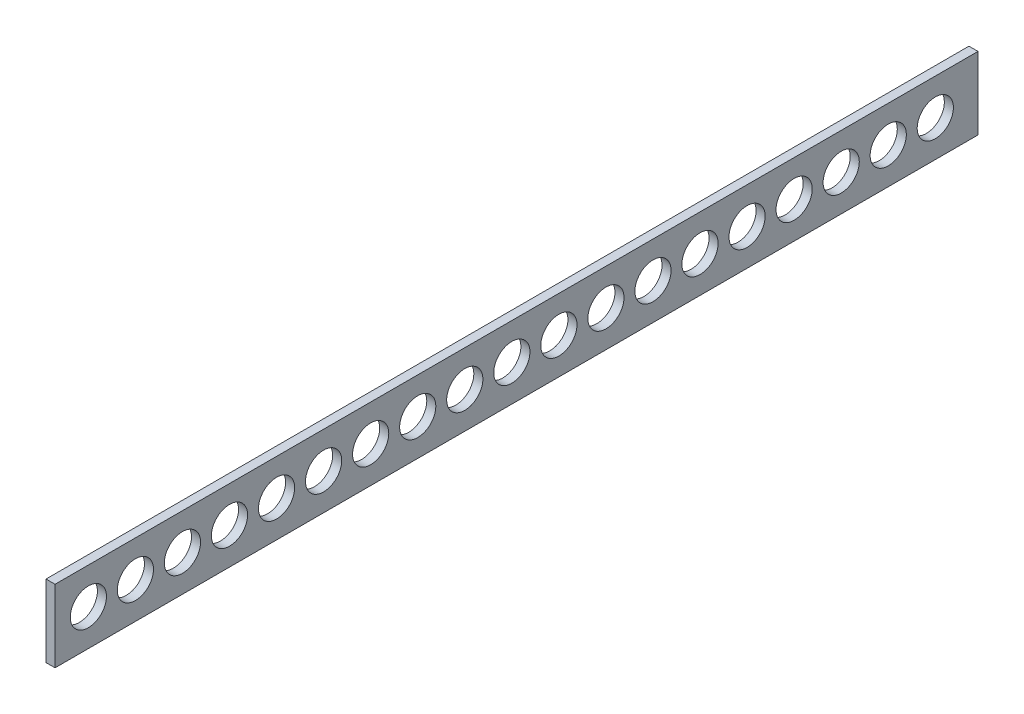
ISO-10303-21;
HEADER;
FILE_DESCRIPTION(('STEP AP214'),'2;1');
FILE_NAME('part.step','',(''),(''),'','','');
FILE_SCHEMA(('AUTOMOTIVE_DESIGN { 1 0 10303 214 1 1 1 1 }'));
ENDSEC;
DATA;
#1=APPLICATION_CONTEXT('core data for automotive mechanical design processes');
#2=APPLICATION_PROTOCOL_DEFINITION('international standard','automotive_design',2000,#1);
#3=PRODUCT_CONTEXT('',#1,'mechanical');
#4=PRODUCT('Part','Part','',(#3));
#5=PRODUCT_RELATED_PRODUCT_CATEGORY('part','',(#4));
#6=PRODUCT_DEFINITION_FORMATION('','',#4);
#7=PRODUCT_DEFINITION_CONTEXT('part definition',#1,'design');
#8=PRODUCT_DEFINITION('design','',#6,#7);
#9=PRODUCT_DEFINITION_SHAPE('','',#8);
#10=(LENGTH_UNIT() NAMED_UNIT(*) SI_UNIT(.MILLI.,.METRE.));
#11=(NAMED_UNIT(*) PLANE_ANGLE_UNIT() SI_UNIT($,.RADIAN.));
#12=(NAMED_UNIT(*) SI_UNIT($,.STERADIAN.) SOLID_ANGLE_UNIT());
#13=UNCERTAINTY_MEASURE_WITH_UNIT(LENGTH_MEASURE(1.E-05),#10,'distance_accuracy_value','');
#14=(GEOMETRIC_REPRESENTATION_CONTEXT(3) GLOBAL_UNCERTAINTY_ASSIGNED_CONTEXT((#13)) GLOBAL_UNIT_ASSIGNED_CONTEXT((#10,
#11,#12)) REPRESENTATION_CONTEXT('',''));
#15=CARTESIAN_POINT('',(0.,0.,0.));
#16=DIRECTION('',(0.,0.,1.));
#17=DIRECTION('',(1.,0.,0.));
#18=AXIS2_PLACEMENT_3D('',#15,#16,#17);
#19=CARTESIAN_POINT('',(6.35,0.,0.));
#20=DIRECTION('',(-1.,0.,0.));
#21=DIRECTION('',(0.,0.,1.));
#22=AXIS2_PLACEMENT_3D('',#19,#20,#21);
#23=PLANE('',#22);
#24=DIRECTION('',(0.,-1.,0.));
#25=VECTOR('',#24,1.);
#26=CARTESIAN_POINT('',(6.35,0.,0.));
#27=LINE('',#26,#25);
#28=CARTESIAN_POINT('',(6.35,50.8,0.));
#29=VERTEX_POINT('',#28);
#30=CARTESIAN_POINT('',(6.35,0.,0.));
#31=VERTEX_POINT('',#30);
#32=EDGE_CURVE('E92',#29,#31,#27,.T.);
#33=ORIENTED_EDGE('',*,*,#32,.T.);
#34=DIRECTION('',(0.,0.,-1.));
#35=VECTOR('',#34,1.);
#36=CARTESIAN_POINT('',(6.35,0.,0.));
#37=LINE('',#36,#35);
#38=CARTESIAN_POINT('',(6.35,0.,-647.7));
#39=VERTEX_POINT('',#38);
#40=EDGE_CURVE('E87',#31,#39,#37,.T.);
#41=ORIENTED_EDGE('',*,*,#40,.T.);
#42=DIRECTION('',(0.,1.,0.));
#43=VECTOR('',#42,1.);
#44=CARTESIAN_POINT('',(6.35,0.,-647.7));
#45=LINE('',#44,#43);
#46=CARTESIAN_POINT('',(6.35,50.8,-647.7));
#47=VERTEX_POINT('',#46);
#48=EDGE_CURVE('E90',#39,#47,#45,.T.);
#49=ORIENTED_EDGE('',*,*,#48,.T.);
#50=DIRECTION('',(0.,0.,1.));
#51=VECTOR('',#50,1.);
#52=CARTESIAN_POINT('',(6.35,50.8,0.));
#53=LINE('',#52,#51);
#54=EDGE_CURVE('E57',#47,#29,#53,.T.);
#55=ORIENTED_EDGE('',*,*,#54,.T.);
#56=EDGE_LOOP('',(#33,#41,#49,#55));
#57=FACE_BOUND('',#56,.T.);
#58=CARTESIAN_POINT('',(6.35,25.4,-23.3708321513043));
#59=DIRECTION('',(1.,0.,0.));
#60=DIRECTION('',(0.,0.,-1.));
#61=AXIS2_PLACEMENT_3D('',#58,#59,#60);
#62=CIRCLE('',#61,12.7);
#63=CARTESIAN_POINT('',(6.35,25.4,-36.0708321513043));
#64=VERTEX_POINT('',#63);
#65=EDGE_CURVE('E112',#64,#64,#62,.T.);
#66=ORIENTED_EDGE('',*,*,#65,.F.);
#67=EDGE_LOOP('',(#66));
#68=FACE_BOUND('',#67,.T.);
#69=CARTESIAN_POINT('',(6.35,25.4,-56.3908321513043));
#70=DIRECTION('',(1.,0.,0.));
#71=DIRECTION('',(0.,0.,-1.));
#72=AXIS2_PLACEMENT_3D('',#69,#70,#71);
#73=CIRCLE('',#72,12.7);
#74=CARTESIAN_POINT('',(6.35,25.4,-69.0908321513043));
#75=VERTEX_POINT('',#74);
#76=EDGE_CURVE('E134',#75,#75,#73,.T.);
#77=ORIENTED_EDGE('',*,*,#76,.F.);
#78=EDGE_LOOP('',(#77));
#79=FACE_BOUND('',#78,.T.);
#80=CARTESIAN_POINT('',(6.35,25.4,-89.4108321513043));
#81=DIRECTION('',(1.,0.,0.));
#82=DIRECTION('',(0.,0.,-1.));
#83=AXIS2_PLACEMENT_3D('',#80,#81,#82);
#84=CIRCLE('',#83,12.7);
#85=CARTESIAN_POINT('',(6.35,25.4,-102.110832151304));
#86=VERTEX_POINT('',#85);
#87=EDGE_CURVE('E142',#86,#86,#84,.T.);
#88=ORIENTED_EDGE('',*,*,#87,.F.);
#89=EDGE_LOOP('',(#88));
#90=FACE_BOUND('',#89,.T.);
#91=CARTESIAN_POINT('',(6.35,25.4,-122.430832151304));
#92=DIRECTION('',(1.,0.,0.));
#93=DIRECTION('',(0.,0.,-1.));
#94=AXIS2_PLACEMENT_3D('',#91,#92,#93);
#95=CIRCLE('',#94,12.7);
#96=CARTESIAN_POINT('',(6.35,25.4,-135.130832151304));
#97=VERTEX_POINT('',#96);
#98=EDGE_CURVE('E150',#97,#97,#95,.T.);
#99=ORIENTED_EDGE('',*,*,#98,.F.);
#100=EDGE_LOOP('',(#99));
#101=FACE_BOUND('',#100,.T.);
#102=CARTESIAN_POINT('',(6.35,25.4,-155.450832151304));
#103=DIRECTION('',(1.,0.,0.));
#104=DIRECTION('',(0.,0.,-1.));
#105=AXIS2_PLACEMENT_3D('',#102,#103,#104);
#106=CIRCLE('',#105,12.7);
#107=CARTESIAN_POINT('',(6.35,25.4,-168.150832151304));
#108=VERTEX_POINT('',#107);
#109=EDGE_CURVE('E158',#108,#108,#106,.T.);
#110=ORIENTED_EDGE('',*,*,#109,.F.);
#111=EDGE_LOOP('',(#110));
#112=FACE_BOUND('',#111,.T.);
#113=CARTESIAN_POINT('',(6.35,25.4,-188.470832151304));
#114=DIRECTION('',(1.,0.,0.));
#115=DIRECTION('',(0.,0.,-1.));
#116=AXIS2_PLACEMENT_3D('',#113,#114,#115);
#117=CIRCLE('',#116,12.7);
#118=CARTESIAN_POINT('',(6.35,25.4,-201.170832151304));
#119=VERTEX_POINT('',#118);
#120=EDGE_CURVE('E166',#119,#119,#117,.T.);
#121=ORIENTED_EDGE('',*,*,#120,.F.);
#122=EDGE_LOOP('',(#121));
#123=FACE_BOUND('',#122,.T.);
#124=CARTESIAN_POINT('',(6.35,25.4,-221.490832151304));
#125=DIRECTION('',(1.,0.,0.));
#126=DIRECTION('',(0.,0.,-1.));
#127=AXIS2_PLACEMENT_3D('',#124,#125,#126);
#128=CIRCLE('',#127,12.7);
#129=CARTESIAN_POINT('',(6.35,25.4,-234.190832151304));
#130=VERTEX_POINT('',#129);
#131=EDGE_CURVE('E174',#130,#130,#128,.T.);
#132=ORIENTED_EDGE('',*,*,#131,.F.);
#133=EDGE_LOOP('',(#132));
#134=FACE_BOUND('',#133,.T.);
#135=CARTESIAN_POINT('',(6.35,25.4,-254.510832151304));
#136=DIRECTION('',(1.,0.,0.));
#137=DIRECTION('',(0.,0.,-1.));
#138=AXIS2_PLACEMENT_3D('',#135,#136,#137);
#139=CIRCLE('',#138,12.7);
#140=CARTESIAN_POINT('',(6.35,25.4,-267.210832151304));
#141=VERTEX_POINT('',#140);
#142=EDGE_CURVE('E182',#141,#141,#139,.T.);
#143=ORIENTED_EDGE('',*,*,#142,.F.);
#144=EDGE_LOOP('',(#143));
#145=FACE_BOUND('',#144,.T.);
#146=CARTESIAN_POINT('',(6.35,25.4,-287.530832151304));
#147=DIRECTION('',(1.,0.,0.));
#148=DIRECTION('',(0.,0.,-1.));
#149=AXIS2_PLACEMENT_3D('',#146,#147,#148);
#150=CIRCLE('',#149,12.7);
#151=CARTESIAN_POINT('',(6.35,25.4,-300.230832151304));
#152=VERTEX_POINT('',#151);
#153=EDGE_CURVE('E190',#152,#152,#150,.T.);
#154=ORIENTED_EDGE('',*,*,#153,.F.);
#155=EDGE_LOOP('',(#154));
#156=FACE_BOUND('',#155,.T.);
#157=CARTESIAN_POINT('',(6.35,25.4,-320.550832151304));
#158=DIRECTION('',(1.,0.,0.));
#159=DIRECTION('',(0.,0.,-1.));
#160=AXIS2_PLACEMENT_3D('',#157,#158,#159);
#161=CIRCLE('',#160,12.7);
#162=CARTESIAN_POINT('',(6.35,25.4,-333.250832151304));
#163=VERTEX_POINT('',#162);
#164=EDGE_CURVE('E198',#163,#163,#161,.T.);
#165=ORIENTED_EDGE('',*,*,#164,.F.);
#166=EDGE_LOOP('',(#165));
#167=FACE_BOUND('',#166,.T.);
#168=CARTESIAN_POINT('',(6.35,25.4,-353.570832151304));
#169=DIRECTION('',(1.,0.,0.));
#170=DIRECTION('',(0.,0.,-1.));
#171=AXIS2_PLACEMENT_3D('',#168,#169,#170);
#172=CIRCLE('',#171,12.7);
#173=CARTESIAN_POINT('',(6.35,25.4,-366.270832151304));
#174=VERTEX_POINT('',#173);
#175=EDGE_CURVE('E206',#174,#174,#172,.T.);
#176=ORIENTED_EDGE('',*,*,#175,.F.);
#177=EDGE_LOOP('',(#176));
#178=FACE_BOUND('',#177,.T.);
#179=CARTESIAN_POINT('',(6.35,25.4,-386.590832151304));
#180=DIRECTION('',(1.,0.,0.));
#181=DIRECTION('',(0.,0.,-1.));
#182=AXIS2_PLACEMENT_3D('',#179,#180,#181);
#183=CIRCLE('',#182,12.7);
#184=CARTESIAN_POINT('',(6.35,25.4,-399.290832151304));
#185=VERTEX_POINT('',#184);
#186=EDGE_CURVE('E214',#185,#185,#183,.T.);
#187=ORIENTED_EDGE('',*,*,#186,.F.);
#188=EDGE_LOOP('',(#187));
#189=FACE_BOUND('',#188,.T.);
#190=CARTESIAN_POINT('',(6.35,25.4,-419.610832151304));
#191=DIRECTION('',(1.,0.,0.));
#192=DIRECTION('',(0.,0.,-1.));
#193=AXIS2_PLACEMENT_3D('',#190,#191,#192);
#194=CIRCLE('',#193,12.7);
#195=CARTESIAN_POINT('',(6.35,25.4,-432.310832151304));
#196=VERTEX_POINT('',#195);
#197=EDGE_CURVE('E222',#196,#196,#194,.T.);
#198=ORIENTED_EDGE('',*,*,#197,.F.);
#199=EDGE_LOOP('',(#198));
#200=FACE_BOUND('',#199,.T.);
#201=CARTESIAN_POINT('',(6.35,25.4,-452.630832151304));
#202=DIRECTION('',(1.,0.,0.));
#203=DIRECTION('',(0.,0.,-1.));
#204=AXIS2_PLACEMENT_3D('',#201,#202,#203);
#205=CIRCLE('',#204,12.7);
#206=CARTESIAN_POINT('',(6.35,25.4,-465.330832151304));
#207=VERTEX_POINT('',#206);
#208=EDGE_CURVE('E230',#207,#207,#205,.T.);
#209=ORIENTED_EDGE('',*,*,#208,.F.);
#210=EDGE_LOOP('',(#209));
#211=FACE_BOUND('',#210,.T.);
#212=CARTESIAN_POINT('',(6.35,25.4,-485.650832151304));
#213=DIRECTION('',(1.,0.,0.));
#214=DIRECTION('',(0.,0.,-1.));
#215=AXIS2_PLACEMENT_3D('',#212,#213,#214);
#216=CIRCLE('',#215,12.7);
#217=CARTESIAN_POINT('',(6.35,25.4,-498.350832151304));
#218=VERTEX_POINT('',#217);
#219=EDGE_CURVE('E238',#218,#218,#216,.T.);
#220=ORIENTED_EDGE('',*,*,#219,.F.);
#221=EDGE_LOOP('',(#220));
#222=FACE_BOUND('',#221,.T.);
#223=CARTESIAN_POINT('',(6.35,25.4,-518.670832151304));
#224=DIRECTION('',(1.,0.,0.));
#225=DIRECTION('',(0.,0.,-1.));
#226=AXIS2_PLACEMENT_3D('',#223,#224,#225);
#227=CIRCLE('',#226,12.7000000000001);
#228=CARTESIAN_POINT('',(6.35,25.4,-531.370832151304));
#229=VERTEX_POINT('',#228);
#230=EDGE_CURVE('E246',#229,#229,#227,.T.);
#231=ORIENTED_EDGE('',*,*,#230,.F.);
#232=EDGE_LOOP('',(#231));
#233=FACE_BOUND('',#232,.T.);
#234=CARTESIAN_POINT('',(6.35,25.4,-551.690832151304));
#235=DIRECTION('',(1.,0.,0.));
#236=DIRECTION('',(0.,0.,-1.));
#237=AXIS2_PLACEMENT_3D('',#234,#235,#236);
#238=CIRCLE('',#237,12.7);
#239=CARTESIAN_POINT('',(6.35,25.4,-564.390832151304));
#240=VERTEX_POINT('',#239);
#241=EDGE_CURVE('E254',#240,#240,#238,.T.);
#242=ORIENTED_EDGE('',*,*,#241,.F.);
#243=EDGE_LOOP('',(#242));
#244=FACE_BOUND('',#243,.T.);
#245=CARTESIAN_POINT('',(6.35,25.4,-584.710832151304));
#246=DIRECTION('',(1.,0.,0.));
#247=DIRECTION('',(0.,0.,-1.));
#248=AXIS2_PLACEMENT_3D('',#245,#246,#247);
#249=CIRCLE('',#248,12.7);
#250=CARTESIAN_POINT('',(6.35,25.4,-597.410832151304));
#251=VERTEX_POINT('',#250);
#252=EDGE_CURVE('E262',#251,#251,#249,.T.);
#253=ORIENTED_EDGE('',*,*,#252,.F.);
#254=EDGE_LOOP('',(#253));
#255=FACE_BOUND('',#254,.T.);
#256=CARTESIAN_POINT('',(6.35,25.4,-617.730832151304));
#257=DIRECTION('',(1.,0.,0.));
#258=DIRECTION('',(0.,0.,-1.));
#259=AXIS2_PLACEMENT_3D('',#256,#257,#258);
#260=CIRCLE('',#259,12.7);
#261=CARTESIAN_POINT('',(6.35,25.4,-630.430832151304));
#262=VERTEX_POINT('',#261);
#263=EDGE_CURVE('E270',#262,#262,#260,.T.);
#264=ORIENTED_EDGE('',*,*,#263,.F.);
#265=EDGE_LOOP('',(#264));
#266=FACE_BOUND('',#265,.T.);
#267=ADVANCED_FACE('F39',(#57,#68,#79,#90,#101,#112,#123,#134,#145,#156,#167,#178,#189,#200,
#211,#222,#233,#244,#255,#266),#23,.F.);
#268=CARTESIAN_POINT('',(0.,0.,0.));
#269=DIRECTION('',(-1.,0.,0.));
#270=DIRECTION('',(0.,0.,1.));
#271=AXIS2_PLACEMENT_3D('',#268,#269,#270);
#272=PLANE('',#271);
#273=CARTESIAN_POINT('',(0.,25.4,-584.710832151304));
#274=DIRECTION('',(1.,0.,0.));
#275=DIRECTION('',(0.,0.,-1.));
#276=AXIS2_PLACEMENT_3D('',#273,#274,#275);
#277=CIRCLE('',#276,12.7);
#278=CARTESIAN_POINT('',(0.,25.4,-597.410832151304));
#279=VERTEX_POINT('',#278);
#280=EDGE_CURVE('E266',#279,#279,#277,.T.);
#281=ORIENTED_EDGE('',*,*,#280,.T.);
#282=EDGE_LOOP('',(#281));
#283=FACE_BOUND('',#282,.T.);
#284=CARTESIAN_POINT('',(0.,25.4,-518.670832151304));
#285=DIRECTION('',(1.,0.,0.));
#286=DIRECTION('',(0.,0.,-1.));
#287=AXIS2_PLACEMENT_3D('',#284,#285,#286);
#288=CIRCLE('',#287,12.7000000000001);
#289=CARTESIAN_POINT('',(0.,25.4,-531.370832151304));
#290=VERTEX_POINT('',#289);
#291=EDGE_CURVE('E250',#290,#290,#288,.T.);
#292=ORIENTED_EDGE('',*,*,#291,.T.);
#293=EDGE_LOOP('',(#292));
#294=FACE_BOUND('',#293,.T.);
#295=CARTESIAN_POINT('',(0.,25.4,-452.630832151304));
#296=DIRECTION('',(1.,0.,0.));
#297=DIRECTION('',(0.,0.,-1.));
#298=AXIS2_PLACEMENT_3D('',#295,#296,#297);
#299=CIRCLE('',#298,12.7);
#300=CARTESIAN_POINT('',(0.,25.4,-465.330832151304));
#301=VERTEX_POINT('',#300);
#302=EDGE_CURVE('E234',#301,#301,#299,.T.);
#303=ORIENTED_EDGE('',*,*,#302,.T.);
#304=EDGE_LOOP('',(#303));
#305=FACE_BOUND('',#304,.T.);
#306=CARTESIAN_POINT('',(0.,25.4,-386.590832151304));
#307=DIRECTION('',(1.,0.,0.));
#308=DIRECTION('',(0.,0.,-1.));
#309=AXIS2_PLACEMENT_3D('',#306,#307,#308);
#310=CIRCLE('',#309,12.7);
#311=CARTESIAN_POINT('',(0.,25.4,-399.290832151304));
#312=VERTEX_POINT('',#311);
#313=EDGE_CURVE('E218',#312,#312,#310,.T.);
#314=ORIENTED_EDGE('',*,*,#313,.T.);
#315=EDGE_LOOP('',(#314));
#316=FACE_BOUND('',#315,.T.);
#317=CARTESIAN_POINT('',(0.,25.4,-320.550832151304));
#318=DIRECTION('',(1.,0.,0.));
#319=DIRECTION('',(0.,0.,-1.));
#320=AXIS2_PLACEMENT_3D('',#317,#318,#319);
#321=CIRCLE('',#320,12.7);
#322=CARTESIAN_POINT('',(0.,25.4,-333.250832151304));
#323=VERTEX_POINT('',#322);
#324=EDGE_CURVE('E202',#323,#323,#321,.T.);
#325=ORIENTED_EDGE('',*,*,#324,.T.);
#326=EDGE_LOOP('',(#325));
#327=FACE_BOUND('',#326,.T.);
#328=CARTESIAN_POINT('',(0.,25.4,-254.510832151304));
#329=DIRECTION('',(1.,0.,0.));
#330=DIRECTION('',(0.,0.,-1.));
#331=AXIS2_PLACEMENT_3D('',#328,#329,#330);
#332=CIRCLE('',#331,12.7);
#333=CARTESIAN_POINT('',(0.,25.4,-267.210832151304));
#334=VERTEX_POINT('',#333);
#335=EDGE_CURVE('E186',#334,#334,#332,.T.);
#336=ORIENTED_EDGE('',*,*,#335,.T.);
#337=EDGE_LOOP('',(#336));
#338=FACE_BOUND('',#337,.T.);
#339=CARTESIAN_POINT('',(0.,25.4,-188.470832151304));
#340=DIRECTION('',(1.,0.,0.));
#341=DIRECTION('',(0.,0.,-1.));
#342=AXIS2_PLACEMENT_3D('',#339,#340,#341);
#343=CIRCLE('',#342,12.7);
#344=CARTESIAN_POINT('',(0.,25.4,-201.170832151304));
#345=VERTEX_POINT('',#344);
#346=EDGE_CURVE('E170',#345,#345,#343,.T.);
#347=ORIENTED_EDGE('',*,*,#346,.T.);
#348=EDGE_LOOP('',(#347));
#349=FACE_BOUND('',#348,.T.);
#350=CARTESIAN_POINT('',(0.,25.4,-122.430832151304));
#351=DIRECTION('',(1.,0.,0.));
#352=DIRECTION('',(0.,0.,-1.));
#353=AXIS2_PLACEMENT_3D('',#350,#351,#352);
#354=CIRCLE('',#353,12.7);
#355=CARTESIAN_POINT('',(0.,25.4,-135.130832151304));
#356=VERTEX_POINT('',#355);
#357=EDGE_CURVE('E154',#356,#356,#354,.T.);
#358=ORIENTED_EDGE('',*,*,#357,.T.);
#359=EDGE_LOOP('',(#358));
#360=FACE_BOUND('',#359,.T.);
#361=CARTESIAN_POINT('',(0.,25.4,-56.3908321513043));
#362=DIRECTION('',(1.,0.,0.));
#363=DIRECTION('',(0.,0.,-1.));
#364=AXIS2_PLACEMENT_3D('',#361,#362,#363);
#365=CIRCLE('',#364,12.7);
#366=CARTESIAN_POINT('',(0.,25.4,-69.0908321513043));
#367=VERTEX_POINT('',#366);
#368=EDGE_CURVE('E138',#367,#367,#365,.T.);
#369=ORIENTED_EDGE('',*,*,#368,.T.);
#370=EDGE_LOOP('',(#369));
#371=FACE_BOUND('',#370,.T.);
#372=DIRECTION('',(0.,-1.,0.));
#373=VECTOR('',#372,1.);
#374=CARTESIAN_POINT('',(0.,0.,0.));
#375=LINE('',#374,#373);
#376=CARTESIAN_POINT('',(0.,50.8,0.));
#377=VERTEX_POINT('',#376);
#378=CARTESIAN_POINT('',(0.,0.,0.));
#379=VERTEX_POINT('',#378);
#380=EDGE_CURVE('E108',#377,#379,#375,.T.);
#381=ORIENTED_EDGE('',*,*,#380,.F.);
#382=DIRECTION('',(0.,0.,1.));
#383=VECTOR('',#382,1.);
#384=CARTESIAN_POINT('',(0.,50.8,0.));
#385=LINE('',#384,#383);
#386=CARTESIAN_POINT('',(0.,50.8,-647.7));
#387=VERTEX_POINT('',#386);
#388=EDGE_CURVE('E80',#387,#377,#385,.T.);
#389=ORIENTED_EDGE('',*,*,#388,.F.);
#390=DIRECTION('',(0.,1.,0.));
#391=VECTOR('',#390,1.);
#392=CARTESIAN_POINT('',(0.,0.,-647.7));
#393=LINE('',#392,#391);
#394=CARTESIAN_POINT('',(0.,0.,-647.7));
#395=VERTEX_POINT('',#394);
#396=EDGE_CURVE('E74',#395,#387,#393,.T.);
#397=ORIENTED_EDGE('',*,*,#396,.F.);
#398=DIRECTION('',(0.,0.,-1.));
#399=VECTOR('',#398,1.);
#400=CARTESIAN_POINT('',(0.,0.,0.));
#401=LINE('',#400,#399);
#402=EDGE_CURVE('E97',#379,#395,#401,.T.);
#403=ORIENTED_EDGE('',*,*,#402,.F.);
#404=EDGE_LOOP('',(#381,#389,#397,#403));
#405=FACE_BOUND('',#404,.T.);
#406=CARTESIAN_POINT('',(0.,25.4,-23.3708321513043));
#407=DIRECTION('',(1.,0.,0.));
#408=DIRECTION('',(0.,0.,-1.));
#409=AXIS2_PLACEMENT_3D('',#406,#407,#408);
#410=CIRCLE('',#409,12.7);
#411=CARTESIAN_POINT('',(0.,25.4,-36.0708321513043));
#412=VERTEX_POINT('',#411);
#413=EDGE_CURVE('E130',#412,#412,#410,.T.);
#414=ORIENTED_EDGE('',*,*,#413,.T.);
#415=EDGE_LOOP('',(#414));
#416=FACE_BOUND('',#415,.T.);
#417=CARTESIAN_POINT('',(0.,25.4,-89.4108321513043));
#418=DIRECTION('',(1.,0.,0.));
#419=DIRECTION('',(0.,0.,-1.));
#420=AXIS2_PLACEMENT_3D('',#417,#418,#419);
#421=CIRCLE('',#420,12.7);
#422=CARTESIAN_POINT('',(0.,25.4,-102.110832151304));
#423=VERTEX_POINT('',#422);
#424=EDGE_CURVE('E146',#423,#423,#421,.T.);
#425=ORIENTED_EDGE('',*,*,#424,.T.);
#426=EDGE_LOOP('',(#425));
#427=FACE_BOUND('',#426,.T.);
#428=CARTESIAN_POINT('',(0.,25.4,-155.450832151304));
#429=DIRECTION('',(1.,0.,0.));
#430=DIRECTION('',(0.,0.,-1.));
#431=AXIS2_PLACEMENT_3D('',#428,#429,#430);
#432=CIRCLE('',#431,12.7);
#433=CARTESIAN_POINT('',(0.,25.4,-168.150832151304));
#434=VERTEX_POINT('',#433);
#435=EDGE_CURVE('E162',#434,#434,#432,.T.);
#436=ORIENTED_EDGE('',*,*,#435,.T.);
#437=EDGE_LOOP('',(#436));
#438=FACE_BOUND('',#437,.T.);
#439=CARTESIAN_POINT('',(0.,25.4,-221.490832151304));
#440=DIRECTION('',(1.,0.,0.));
#441=DIRECTION('',(0.,0.,-1.));
#442=AXIS2_PLACEMENT_3D('',#439,#440,#441);
#443=CIRCLE('',#442,12.7);
#444=CARTESIAN_POINT('',(0.,25.4,-234.190832151304));
#445=VERTEX_POINT('',#444);
#446=EDGE_CURVE('E178',#445,#445,#443,.T.);
#447=ORIENTED_EDGE('',*,*,#446,.T.);
#448=EDGE_LOOP('',(#447));
#449=FACE_BOUND('',#448,.T.);
#450=CARTESIAN_POINT('',(0.,25.4,-287.530832151304));
#451=DIRECTION('',(1.,0.,0.));
#452=DIRECTION('',(0.,0.,-1.));
#453=AXIS2_PLACEMENT_3D('',#450,#451,#452);
#454=CIRCLE('',#453,12.7);
#455=CARTESIAN_POINT('',(0.,25.4,-300.230832151304));
#456=VERTEX_POINT('',#455);
#457=EDGE_CURVE('E194',#456,#456,#454,.T.);
#458=ORIENTED_EDGE('',*,*,#457,.T.);
#459=EDGE_LOOP('',(#458));
#460=FACE_BOUND('',#459,.T.);
#461=CARTESIAN_POINT('',(0.,25.4,-353.570832151304));
#462=DIRECTION('',(1.,0.,0.));
#463=DIRECTION('',(0.,0.,-1.));
#464=AXIS2_PLACEMENT_3D('',#461,#462,#463);
#465=CIRCLE('',#464,12.7);
#466=CARTESIAN_POINT('',(0.,25.4,-366.270832151304));
#467=VERTEX_POINT('',#466);
#468=EDGE_CURVE('E210',#467,#467,#465,.T.);
#469=ORIENTED_EDGE('',*,*,#468,.T.);
#470=EDGE_LOOP('',(#469));
#471=FACE_BOUND('',#470,.T.);
#472=CARTESIAN_POINT('',(0.,25.4,-419.610832151304));
#473=DIRECTION('',(1.,0.,0.));
#474=DIRECTION('',(0.,0.,-1.));
#475=AXIS2_PLACEMENT_3D('',#472,#473,#474);
#476=CIRCLE('',#475,12.7);
#477=CARTESIAN_POINT('',(0.,25.4,-432.310832151304));
#478=VERTEX_POINT('',#477);
#479=EDGE_CURVE('E226',#478,#478,#476,.T.);
#480=ORIENTED_EDGE('',*,*,#479,.T.);
#481=EDGE_LOOP('',(#480));
#482=FACE_BOUND('',#481,.T.);
#483=CARTESIAN_POINT('',(0.,25.4,-485.650832151304));
#484=DIRECTION('',(1.,0.,0.));
#485=DIRECTION('',(0.,0.,-1.));
#486=AXIS2_PLACEMENT_3D('',#483,#484,#485);
#487=CIRCLE('',#486,12.7);
#488=CARTESIAN_POINT('',(0.,25.4,-498.350832151304));
#489=VERTEX_POINT('',#488);
#490=EDGE_CURVE('E242',#489,#489,#487,.T.);
#491=ORIENTED_EDGE('',*,*,#490,.T.);
#492=EDGE_LOOP('',(#491));
#493=FACE_BOUND('',#492,.T.);
#494=CARTESIAN_POINT('',(0.,25.4,-551.690832151304));
#495=DIRECTION('',(1.,0.,0.));
#496=DIRECTION('',(0.,0.,-1.));
#497=AXIS2_PLACEMENT_3D('',#494,#495,#496);
#498=CIRCLE('',#497,12.7);
#499=CARTESIAN_POINT('',(0.,25.4,-564.390832151304));
#500=VERTEX_POINT('',#499);
#501=EDGE_CURVE('E258',#500,#500,#498,.T.);
#502=ORIENTED_EDGE('',*,*,#501,.T.);
#503=EDGE_LOOP('',(#502));
#504=FACE_BOUND('',#503,.T.);
#505=CARTESIAN_POINT('',(0.,25.4,-617.730832151304));
#506=DIRECTION('',(1.,0.,0.));
#507=DIRECTION('',(0.,0.,-1.));
#508=AXIS2_PLACEMENT_3D('',#505,#506,#507);
#509=CIRCLE('',#508,12.7);
#510=CARTESIAN_POINT('',(0.,25.4,-630.430832151304));
#511=VERTEX_POINT('',#510);
#512=EDGE_CURVE('E274',#511,#511,#509,.T.);
#513=ORIENTED_EDGE('',*,*,#512,.T.);
#514=EDGE_LOOP('',(#513));
#515=FACE_BOUND('',#514,.T.);
#516=ADVANCED_FACE('F125',(#283,#294,#305,#316,#327,#338,#349,#360,#371,#405,#416,#427,#438,
#449,#460,#471,#482,#493,#504,#515),#272,.T.);
#517=CARTESIAN_POINT('',(6.35,0.,0.));
#518=DIRECTION('',(0.,0.,-1.));
#519=DIRECTION('',(-1.,0.,0.));
#520=AXIS2_PLACEMENT_3D('',#517,#518,#519);
#521=PLANE('',#520);
#522=ORIENTED_EDGE('',*,*,#380,.T.);
#523=DIRECTION('',(-1.,0.,0.));
#524=VECTOR('',#523,1.);
#525=CARTESIAN_POINT('',(6.35,0.,0.));
#526=LINE('',#525,#524);
#527=EDGE_CURVE('E11',#31,#379,#526,.T.);
#528=ORIENTED_EDGE('',*,*,#527,.F.);
#529=ORIENTED_EDGE('',*,*,#32,.F.);
#530=DIRECTION('',(-1.,0.,0.));
#531=VECTOR('',#530,1.);
#532=CARTESIAN_POINT('',(6.35,50.8,0.));
#533=LINE('',#532,#531);
#534=EDGE_CURVE('E104',#29,#377,#533,.T.);
#535=ORIENTED_EDGE('',*,*,#534,.T.);
#536=EDGE_LOOP('',(#522,#528,#529,#535));
#537=FACE_BOUND('',#536,.T.);
#538=ADVANCED_FACE('F41',(#537),#521,.F.);
#539=CARTESIAN_POINT('',(6.35,0.,0.));
#540=DIRECTION('',(0.,1.,0.));
#541=DIRECTION('',(0.,0.,1.));
#542=AXIS2_PLACEMENT_3D('',#539,#540,#541);
#543=PLANE('',#542);
#544=ORIENTED_EDGE('',*,*,#402,.T.);
#545=DIRECTION('',(-1.,0.,0.));
#546=VECTOR('',#545,1.);
#547=CARTESIAN_POINT('',(6.35,0.,-647.7));
#548=LINE('',#547,#546);
#549=EDGE_CURVE('E49',#39,#395,#548,.T.);
#550=ORIENTED_EDGE('',*,*,#549,.F.);
#551=ORIENTED_EDGE('',*,*,#40,.F.);
#552=ORIENTED_EDGE('',*,*,#527,.T.);
#553=EDGE_LOOP('',(#544,#550,#551,#552));
#554=FACE_BOUND('',#553,.T.);
#555=ADVANCED_FACE('F96',(#554),#543,.F.);
#556=CARTESIAN_POINT('',(6.35,0.,-647.7));
#557=DIRECTION('',(0.,0.,1.));
#558=DIRECTION('',(1.,0.,0.));
#559=AXIS2_PLACEMENT_3D('',#556,#557,#558);
#560=PLANE('',#559);
#561=ORIENTED_EDGE('',*,*,#396,.T.);
#562=DIRECTION('',(-1.,0.,0.));
#563=VECTOR('',#562,1.);
#564=CARTESIAN_POINT('',(6.35,50.8,-647.7));
#565=LINE('',#564,#563);
#566=EDGE_CURVE('E99',#47,#387,#565,.T.);
#567=ORIENTED_EDGE('',*,*,#566,.F.);
#568=ORIENTED_EDGE('',*,*,#48,.F.);
#569=ORIENTED_EDGE('',*,*,#549,.T.);
#570=EDGE_LOOP('',(#561,#567,#568,#569));
#571=FACE_BOUND('',#570,.T.);
#572=ADVANCED_FACE('F100',(#571),#560,.F.);
#573=CARTESIAN_POINT('',(6.35,50.8,0.));
#574=DIRECTION('',(0.,-1.,0.));
#575=DIRECTION('',(0.,0.,-1.));
#576=AXIS2_PLACEMENT_3D('',#573,#574,#575);
#577=PLANE('',#576);
#578=ORIENTED_EDGE('',*,*,#388,.T.);
#579=ORIENTED_EDGE('',*,*,#534,.F.);
#580=ORIENTED_EDGE('',*,*,#54,.F.);
#581=ORIENTED_EDGE('',*,*,#566,.T.);
#582=EDGE_LOOP('',(#578,#579,#580,#581));
#583=FACE_BOUND('',#582,.T.);
#584=ADVANCED_FACE('F122',(#583),#577,.F.);
#585=CARTESIAN_POINT('',(6.35,25.4,-23.3708321513043));
#586=DIRECTION('',(-1.,0.,0.));
#587=DIRECTION('',(0.,0.,1.));
#588=AXIS2_PLACEMENT_3D('',#585,#586,#587);
#589=CYLINDRICAL_SURFACE('',#588,12.7);
#590=ORIENTED_EDGE('',*,*,#65,.T.);
#591=EDGE_LOOP('',(#590));
#592=FACE_BOUND('',#591,.T.);
#593=ORIENTED_EDGE('',*,*,#413,.F.);
#594=EDGE_LOOP('',(#593));
#595=FACE_BOUND('',#594,.T.);
#596=ADVANCED_FACE('F293',(#592,#595),#589,.F.);
#597=CARTESIAN_POINT('',(6.35,25.4,-56.3908321513043));
#598=DIRECTION('',(-1.,0.,0.));
#599=DIRECTION('',(0.,0.,1.));
#600=AXIS2_PLACEMENT_3D('',#597,#598,#599);
#601=CYLINDRICAL_SURFACE('',#600,12.7);
#602=ORIENTED_EDGE('',*,*,#76,.T.);
#603=EDGE_LOOP('',(#602));
#604=FACE_BOUND('',#603,.T.);
#605=ORIENTED_EDGE('',*,*,#368,.F.);
#606=EDGE_LOOP('',(#605));
#607=FACE_BOUND('',#606,.T.);
#608=ADVANCED_FACE('F339',(#604,#607),#601,.F.);
#609=CARTESIAN_POINT('',(6.35,25.4,-89.4108321513043));
#610=DIRECTION('',(-1.,0.,0.));
#611=DIRECTION('',(0.,0.,1.));
#612=AXIS2_PLACEMENT_3D('',#609,#610,#611);
#613=CYLINDRICAL_SURFACE('',#612,12.7);
#614=ORIENTED_EDGE('',*,*,#87,.T.);
#615=EDGE_LOOP('',(#614));
#616=FACE_BOUND('',#615,.T.);
#617=ORIENTED_EDGE('',*,*,#424,.F.);
#618=EDGE_LOOP('',(#617));
#619=FACE_BOUND('',#618,.T.);
#620=ADVANCED_FACE('F347',(#616,#619),#613,.F.);
#621=CARTESIAN_POINT('',(6.35,25.4,-122.430832151304));
#622=DIRECTION('',(-1.,0.,0.));
#623=DIRECTION('',(0.,0.,1.));
#624=AXIS2_PLACEMENT_3D('',#621,#622,#623);
#625=CYLINDRICAL_SURFACE('',#624,12.7);
#626=ORIENTED_EDGE('',*,*,#98,.T.);
#627=EDGE_LOOP('',(#626));
#628=FACE_BOUND('',#627,.T.);
#629=ORIENTED_EDGE('',*,*,#357,.F.);
#630=EDGE_LOOP('',(#629));
#631=FACE_BOUND('',#630,.T.);
#632=ADVANCED_FACE('F355',(#628,#631),#625,.F.);
#633=CARTESIAN_POINT('',(6.35,25.4,-155.450832151304));
#634=DIRECTION('',(-1.,0.,0.));
#635=DIRECTION('',(0.,0.,1.));
#636=AXIS2_PLACEMENT_3D('',#633,#634,#635);
#637=CYLINDRICAL_SURFACE('',#636,12.7);
#638=ORIENTED_EDGE('',*,*,#109,.T.);
#639=EDGE_LOOP('',(#638));
#640=FACE_BOUND('',#639,.T.);
#641=ORIENTED_EDGE('',*,*,#435,.F.);
#642=EDGE_LOOP('',(#641));
#643=FACE_BOUND('',#642,.T.);
#644=ADVANCED_FACE('F364',(#640,#643),#637,.F.);
#645=CARTESIAN_POINT('',(6.35,25.4,-188.470832151304));
#646=DIRECTION('',(-1.,0.,0.));
#647=DIRECTION('',(0.,0.,1.));
#648=AXIS2_PLACEMENT_3D('',#645,#646,#647);
#649=CYLINDRICAL_SURFACE('',#648,12.7);
#650=ORIENTED_EDGE('',*,*,#120,.T.);
#651=EDGE_LOOP('',(#650));
#652=FACE_BOUND('',#651,.T.);
#653=ORIENTED_EDGE('',*,*,#346,.F.);
#654=EDGE_LOOP('',(#653));
#655=FACE_BOUND('',#654,.T.);
#656=ADVANCED_FACE('F373',(#652,#655),#649,.F.);
#657=CARTESIAN_POINT('',(6.35,25.4,-221.490832151304));
#658=DIRECTION('',(-1.,0.,0.));
#659=DIRECTION('',(0.,0.,1.));
#660=AXIS2_PLACEMENT_3D('',#657,#658,#659);
#661=CYLINDRICAL_SURFACE('',#660,12.7);
#662=ORIENTED_EDGE('',*,*,#131,.T.);
#663=EDGE_LOOP('',(#662));
#664=FACE_BOUND('',#663,.T.);
#665=ORIENTED_EDGE('',*,*,#446,.F.);
#666=EDGE_LOOP('',(#665));
#667=FACE_BOUND('',#666,.T.);
#668=ADVANCED_FACE('F382',(#664,#667),#661,.F.);
#669=CARTESIAN_POINT('',(6.35,25.4,-254.510832151304));
#670=DIRECTION('',(-1.,0.,0.));
#671=DIRECTION('',(0.,0.,1.));
#672=AXIS2_PLACEMENT_3D('',#669,#670,#671);
#673=CYLINDRICAL_SURFACE('',#672,12.7);
#674=ORIENTED_EDGE('',*,*,#142,.T.);
#675=EDGE_LOOP('',(#674));
#676=FACE_BOUND('',#675,.T.);
#677=ORIENTED_EDGE('',*,*,#335,.F.);
#678=EDGE_LOOP('',(#677));
#679=FACE_BOUND('',#678,.T.);
#680=ADVANCED_FACE('F391',(#676,#679),#673,.F.);
#681=CARTESIAN_POINT('',(6.35,25.4,-287.530832151304));
#682=DIRECTION('',(-1.,0.,0.));
#683=DIRECTION('',(0.,0.,1.));
#684=AXIS2_PLACEMENT_3D('',#681,#682,#683);
#685=CYLINDRICAL_SURFACE('',#684,12.7);
#686=ORIENTED_EDGE('',*,*,#153,.T.);
#687=EDGE_LOOP('',(#686));
#688=FACE_BOUND('',#687,.T.);
#689=ORIENTED_EDGE('',*,*,#457,.F.);
#690=EDGE_LOOP('',(#689));
#691=FACE_BOUND('',#690,.T.);
#692=ADVANCED_FACE('F400',(#688,#691),#685,.F.);
#693=CARTESIAN_POINT('',(6.35,25.4,-320.550832151304));
#694=DIRECTION('',(-1.,0.,0.));
#695=DIRECTION('',(0.,0.,1.));
#696=AXIS2_PLACEMENT_3D('',#693,#694,#695);
#697=CYLINDRICAL_SURFACE('',#696,12.7);
#698=ORIENTED_EDGE('',*,*,#164,.T.);
#699=EDGE_LOOP('',(#698));
#700=FACE_BOUND('',#699,.T.);
#701=ORIENTED_EDGE('',*,*,#324,.F.);
#702=EDGE_LOOP('',(#701));
#703=FACE_BOUND('',#702,.T.);
#704=ADVANCED_FACE('F409',(#700,#703),#697,.F.);
#705=CARTESIAN_POINT('',(6.35,25.4,-353.570832151304));
#706=DIRECTION('',(-1.,0.,0.));
#707=DIRECTION('',(0.,0.,1.));
#708=AXIS2_PLACEMENT_3D('',#705,#706,#707);
#709=CYLINDRICAL_SURFACE('',#708,12.7);
#710=ORIENTED_EDGE('',*,*,#175,.T.);
#711=EDGE_LOOP('',(#710));
#712=FACE_BOUND('',#711,.T.);
#713=ORIENTED_EDGE('',*,*,#468,.F.);
#714=EDGE_LOOP('',(#713));
#715=FACE_BOUND('',#714,.T.);
#716=ADVANCED_FACE('F418',(#712,#715),#709,.F.);
#717=CARTESIAN_POINT('',(6.35,25.4,-386.590832151304));
#718=DIRECTION('',(-1.,0.,0.));
#719=DIRECTION('',(0.,0.,1.));
#720=AXIS2_PLACEMENT_3D('',#717,#718,#719);
#721=CYLINDRICAL_SURFACE('',#720,12.7);
#722=ORIENTED_EDGE('',*,*,#186,.T.);
#723=EDGE_LOOP('',(#722));
#724=FACE_BOUND('',#723,.T.);
#725=ORIENTED_EDGE('',*,*,#313,.F.);
#726=EDGE_LOOP('',(#725));
#727=FACE_BOUND('',#726,.T.);
#728=ADVANCED_FACE('F427',(#724,#727),#721,.F.);
#729=CARTESIAN_POINT('',(6.35,25.4,-419.610832151304));
#730=DIRECTION('',(-1.,0.,0.));
#731=DIRECTION('',(0.,0.,1.));
#732=AXIS2_PLACEMENT_3D('',#729,#730,#731);
#733=CYLINDRICAL_SURFACE('',#732,12.7);
#734=ORIENTED_EDGE('',*,*,#197,.T.);
#735=EDGE_LOOP('',(#734));
#736=FACE_BOUND('',#735,.T.);
#737=ORIENTED_EDGE('',*,*,#479,.F.);
#738=EDGE_LOOP('',(#737));
#739=FACE_BOUND('',#738,.T.);
#740=ADVANCED_FACE('F436',(#736,#739),#733,.F.);
#741=CARTESIAN_POINT('',(6.35,25.4,-452.630832151304));
#742=DIRECTION('',(-1.,0.,0.));
#743=DIRECTION('',(0.,0.,1.));
#744=AXIS2_PLACEMENT_3D('',#741,#742,#743);
#745=CYLINDRICAL_SURFACE('',#744,12.7);
#746=ORIENTED_EDGE('',*,*,#208,.T.);
#747=EDGE_LOOP('',(#746));
#748=FACE_BOUND('',#747,.T.);
#749=ORIENTED_EDGE('',*,*,#302,.F.);
#750=EDGE_LOOP('',(#749));
#751=FACE_BOUND('',#750,.T.);
#752=ADVANCED_FACE('F445',(#748,#751),#745,.F.);
#753=CARTESIAN_POINT('',(6.35,25.4,-485.650832151304));
#754=DIRECTION('',(-1.,0.,0.));
#755=DIRECTION('',(0.,0.,1.));
#756=AXIS2_PLACEMENT_3D('',#753,#754,#755);
#757=CYLINDRICAL_SURFACE('',#756,12.7);
#758=ORIENTED_EDGE('',*,*,#219,.T.);
#759=EDGE_LOOP('',(#758));
#760=FACE_BOUND('',#759,.T.);
#761=ORIENTED_EDGE('',*,*,#490,.F.);
#762=EDGE_LOOP('',(#761));
#763=FACE_BOUND('',#762,.T.);
#764=ADVANCED_FACE('F454',(#760,#763),#757,.F.);
#765=CARTESIAN_POINT('',(6.35,25.4,-518.670832151304));
#766=DIRECTION('',(-1.,0.,0.));
#767=DIRECTION('',(0.,0.,1.));
#768=AXIS2_PLACEMENT_3D('',#765,#766,#767);
#769=CYLINDRICAL_SURFACE('',#768,12.7000000000001);
#770=ORIENTED_EDGE('',*,*,#230,.T.);
#771=EDGE_LOOP('',(#770));
#772=FACE_BOUND('',#771,.T.);
#773=ORIENTED_EDGE('',*,*,#291,.F.);
#774=EDGE_LOOP('',(#773));
#775=FACE_BOUND('',#774,.T.);
#776=ADVANCED_FACE('F463',(#772,#775),#769,.F.);
#777=CARTESIAN_POINT('',(6.35,25.4,-551.690832151304));
#778=DIRECTION('',(-1.,0.,0.));
#779=DIRECTION('',(0.,0.,1.));
#780=AXIS2_PLACEMENT_3D('',#777,#778,#779);
#781=CYLINDRICAL_SURFACE('',#780,12.7);
#782=ORIENTED_EDGE('',*,*,#241,.T.);
#783=EDGE_LOOP('',(#782));
#784=FACE_BOUND('',#783,.T.);
#785=ORIENTED_EDGE('',*,*,#501,.F.);
#786=EDGE_LOOP('',(#785));
#787=FACE_BOUND('',#786,.T.);
#788=ADVANCED_FACE('F472',(#784,#787),#781,.F.);
#789=CARTESIAN_POINT('',(6.35,25.4,-584.710832151304));
#790=DIRECTION('',(-1.,0.,0.));
#791=DIRECTION('',(0.,0.,1.));
#792=AXIS2_PLACEMENT_3D('',#789,#790,#791);
#793=CYLINDRICAL_SURFACE('',#792,12.7);
#794=ORIENTED_EDGE('',*,*,#252,.T.);
#795=EDGE_LOOP('',(#794));
#796=FACE_BOUND('',#795,.T.);
#797=ORIENTED_EDGE('',*,*,#280,.F.);
#798=EDGE_LOOP('',(#797));
#799=FACE_BOUND('',#798,.T.);
#800=ADVANCED_FACE('F481',(#796,#799),#793,.F.);
#801=CARTESIAN_POINT('',(6.35,25.4,-617.730832151304));
#802=DIRECTION('',(-1.,0.,0.));
#803=DIRECTION('',(0.,0.,1.));
#804=AXIS2_PLACEMENT_3D('',#801,#802,#803);
#805=CYLINDRICAL_SURFACE('',#804,12.7);
#806=ORIENTED_EDGE('',*,*,#263,.T.);
#807=EDGE_LOOP('',(#806));
#808=FACE_BOUND('',#807,.T.);
#809=ORIENTED_EDGE('',*,*,#512,.F.);
#810=EDGE_LOOP('',(#809));
#811=FACE_BOUND('',#810,.T.);
#812=ADVANCED_FACE('F282',(#808,#811),#805,.F.);
#813=CLOSED_SHELL('',(#267,#516,#538,#555,#572,#584,#596,#608,#620,#632,#644,#656,#668,#680,
#692,#704,#716,#728,#740,#752,#764,#776,#788,#800,#812));
#814=MANIFOLD_SOLID_BREP('B2',#813);
#815=ADVANCED_BREP_SHAPE_REPRESENTATION('',(#18,#814),#14);
#816=SHAPE_DEFINITION_REPRESENTATION(#9,#815);
ENDSEC;
END-ISO-10303-21;
